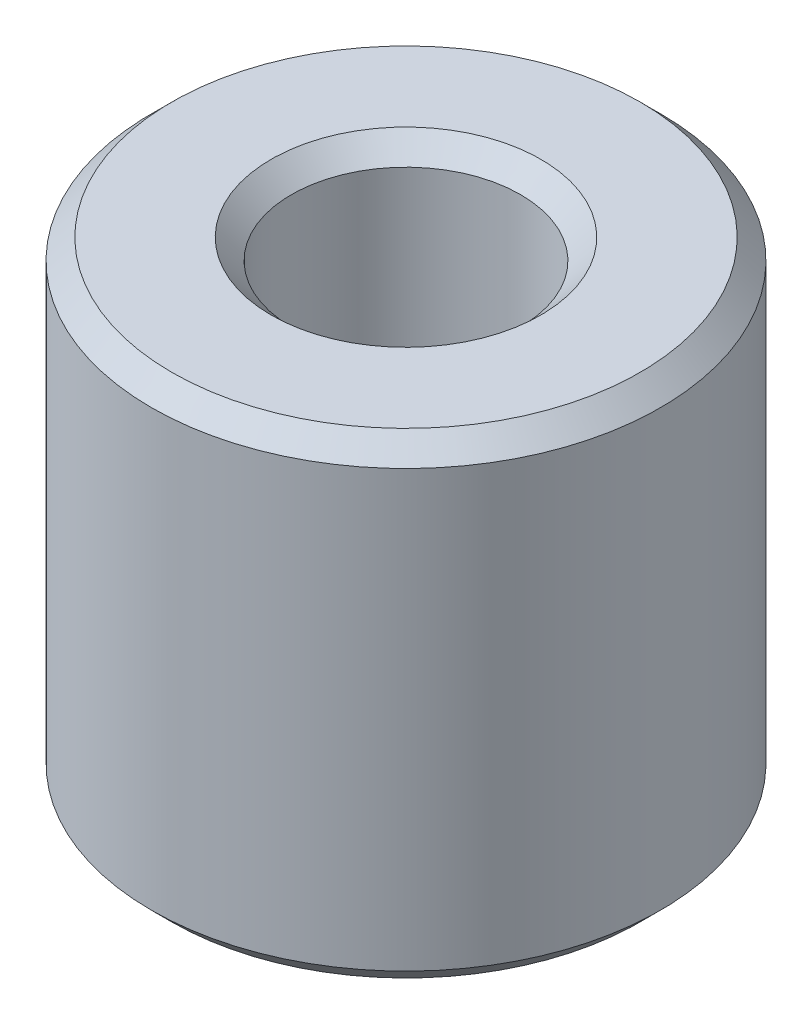
ISO-10303-21;
HEADER;
FILE_DESCRIPTION(('STEP AP214'),'2;1');
FILE_NAME('part.step','',(''),(''),'','','');
FILE_SCHEMA(('AUTOMOTIVE_DESIGN { 1 0 10303 214 1 1 1 1 }'));
ENDSEC;
DATA;
#1=APPLICATION_CONTEXT('core data for automotive mechanical design processes');
#2=APPLICATION_PROTOCOL_DEFINITION('international standard','automotive_design',2000,#1);
#3=PRODUCT_CONTEXT('',#1,'mechanical');
#4=PRODUCT('Part','Part','',(#3));
#5=PRODUCT_RELATED_PRODUCT_CATEGORY('part','',(#4));
#6=PRODUCT_DEFINITION_FORMATION('','',#4);
#7=PRODUCT_DEFINITION_CONTEXT('part definition',#1,'design');
#8=PRODUCT_DEFINITION('design','',#6,#7);
#9=PRODUCT_DEFINITION_SHAPE('','',#8);
#10=(LENGTH_UNIT() NAMED_UNIT(*) SI_UNIT(.MILLI.,.METRE.));
#11=(NAMED_UNIT(*) PLANE_ANGLE_UNIT() SI_UNIT($,.RADIAN.));
#12=(NAMED_UNIT(*) SI_UNIT($,.STERADIAN.) SOLID_ANGLE_UNIT());
#13=UNCERTAINTY_MEASURE_WITH_UNIT(LENGTH_MEASURE(1.E-05),#10,'distance_accuracy_value','');
#14=(GEOMETRIC_REPRESENTATION_CONTEXT(3) GLOBAL_UNCERTAINTY_ASSIGNED_CONTEXT((#13)) GLOBAL_UNIT_ASSIGNED_CONTEXT((#10,
#11,#12)) REPRESENTATION_CONTEXT('',''));
#15=CARTESIAN_POINT('',(0.,0.,0.));
#16=DIRECTION('',(0.,0.,1.));
#17=DIRECTION('',(1.,0.,0.));
#18=AXIS2_PLACEMENT_3D('',#15,#16,#17);
#19=CARTESIAN_POINT('',(0.,18.7,0.));
#20=DIRECTION('',(0.,1.,0.));
#21=DIRECTION('',(0.,0.,1.));
#22=AXIS2_PLACEMENT_3D('',#19,#20,#21);
#23=PLANE('',#22);
#24=CARTESIAN_POINT('',(0.,18.7,0.));
#25=DIRECTION('',(0.,1.,0.));
#26=DIRECTION('',(0.,0.,1.));
#27=AXIS2_PLACEMENT_3D('',#24,#25,#26);
#28=CIRCLE('',#27,9.2);
#29=CARTESIAN_POINT('',(0.,18.7,9.2));
#30=VERTEX_POINT('',#29);
#31=EDGE_CURVE('E12',#30,#30,#28,.T.);
#32=ORIENTED_EDGE('',*,*,#31,.T.);
#33=EDGE_LOOP('',(#32));
#34=FACE_BOUND('',#33,.T.);
#35=CARTESIAN_POINT('',(0.,18.7,0.));
#36=DIRECTION('',(0.,1.,0.));
#37=DIRECTION('',(0.,0.,1.));
#38=AXIS2_PLACEMENT_3D('',#35,#36,#37);
#39=CIRCLE('',#38,5.3);
#40=CARTESIAN_POINT('',(0.,18.7,5.3));
#41=VERTEX_POINT('',#40);
#42=EDGE_CURVE('E51',#41,#41,#39,.F.);
#43=ORIENTED_EDGE('',*,*,#42,.T.);
#44=EDGE_LOOP('',(#43));
#45=FACE_BOUND('',#44,.T.);
#46=ADVANCED_FACE('F44',(#34,#45),#23,.T.);
#47=CARTESIAN_POINT('',(0.,0.,0.));
#48=DIRECTION('',(0.,1.,0.));
#49=DIRECTION('',(0.,0.,1.));
#50=AXIS2_PLACEMENT_3D('',#47,#48,#49);
#51=PLANE('',#50);
#52=CARTESIAN_POINT('',(0.,0.,0.));
#53=DIRECTION('',(0.,1.,0.));
#54=DIRECTION('',(0.,0.,1.));
#55=AXIS2_PLACEMENT_3D('',#52,#53,#54);
#56=CIRCLE('',#55,9.2);
#57=CARTESIAN_POINT('',(0.,0.,9.2));
#58=VERTEX_POINT('',#57);
#59=EDGE_CURVE('E64',#58,#58,#56,.F.);
#60=ORIENTED_EDGE('',*,*,#59,.T.);
#61=EDGE_LOOP('',(#60));
#62=FACE_BOUND('',#61,.T.);
#63=CARTESIAN_POINT('',(0.,0.,0.));
#64=DIRECTION('',(0.,1.,0.));
#65=DIRECTION('',(0.,0.,1.));
#66=AXIS2_PLACEMENT_3D('',#63,#64,#65);
#67=CIRCLE('',#66,5.3);
#68=CARTESIAN_POINT('',(0.,0.,5.3));
#69=VERTEX_POINT('',#68);
#70=EDGE_CURVE('E67',#69,#69,#67,.T.);
#71=ORIENTED_EDGE('',*,*,#70,.T.);
#72=EDGE_LOOP('',(#71));
#73=FACE_BOUND('',#72,.T.);
#74=ADVANCED_FACE('F92',(#62,#73),#51,.F.);
#75=CARTESIAN_POINT('',(0.,18.7,0.));
#76=DIRECTION('',(0.,-1.,0.));
#77=DIRECTION('',(0.,0.,-1.));
#78=AXIS2_PLACEMENT_3D('',#75,#76,#77);
#79=CYLINDRICAL_SURFACE('',#78,10.);
#80=CARTESIAN_POINT('',(0.,0.799999999999995,0.));
#81=DIRECTION('',(0.,1.,0.));
#82=DIRECTION('',(0.,0.,1.));
#83=AXIS2_PLACEMENT_3D('',#80,#81,#82);
#84=CIRCLE('',#83,10.);
#85=CARTESIAN_POINT('',(0.,0.799999999999995,10.));
#86=VERTEX_POINT('',#85);
#87=EDGE_CURVE('E70',#86,#86,#84,.T.);
#88=ORIENTED_EDGE('',*,*,#87,.T.);
#89=EDGE_LOOP('',(#88));
#90=FACE_BOUND('',#89,.T.);
#91=CARTESIAN_POINT('',(0.,17.9,0.));
#92=DIRECTION('',(0.,1.,0.));
#93=DIRECTION('',(0.,0.,1.));
#94=AXIS2_PLACEMENT_3D('',#91,#92,#93);
#95=CIRCLE('',#94,10.);
#96=CARTESIAN_POINT('',(0.,17.9,10.));
#97=VERTEX_POINT('',#96);
#98=EDGE_CURVE('E73',#97,#97,#95,.F.);
#99=ORIENTED_EDGE('',*,*,#98,.T.);
#100=EDGE_LOOP('',(#99));
#101=FACE_BOUND('',#100,.T.);
#102=ADVANCED_FACE('F77',(#90,#101),#79,.T.);
#103=CARTESIAN_POINT('',(0.,18.7,0.));
#104=DIRECTION('',(0.,-1.,0.));
#105=DIRECTION('',(0.,0.,-1.));
#106=AXIS2_PLACEMENT_3D('',#103,#104,#105);
#107=CYLINDRICAL_SURFACE('',#106,4.5);
#108=CARTESIAN_POINT('',(0.,0.800000000000002,0.));
#109=DIRECTION('',(0.,1.,0.));
#110=DIRECTION('',(0.,0.,1.));
#111=AXIS2_PLACEMENT_3D('',#108,#109,#110);
#112=CIRCLE('',#111,4.5);
#113=CARTESIAN_POINT('',(0.,0.800000000000002,4.5));
#114=VERTEX_POINT('',#113);
#115=EDGE_CURVE('E55',#114,#114,#112,.F.);
#116=ORIENTED_EDGE('',*,*,#115,.T.);
#117=EDGE_LOOP('',(#116));
#118=FACE_BOUND('',#117,.T.);
#119=CARTESIAN_POINT('',(0.,17.9,0.));
#120=DIRECTION('',(0.,1.,0.));
#121=DIRECTION('',(0.,0.,1.));
#122=AXIS2_PLACEMENT_3D('',#119,#120,#121);
#123=CIRCLE('',#122,4.5);
#124=CARTESIAN_POINT('',(0.,17.9,4.5));
#125=VERTEX_POINT('',#124);
#126=EDGE_CURVE('E59',#125,#125,#123,.T.);
#127=ORIENTED_EDGE('',*,*,#126,.T.);
#128=EDGE_LOOP('',(#127));
#129=FACE_BOUND('',#128,.T.);
#130=ADVANCED_FACE('F100',(#118,#129),#107,.F.);
#131=CARTESIAN_POINT('',(0.,0.799999999999995,0.));
#132=DIRECTION('',(0.,1.,0.));
#133=DIRECTION('',(0.,0.,1.));
#134=AXIS2_PLACEMENT_3D('',#131,#132,#133);
#135=CONICAL_SURFACE('',#134,10.,0.78539816339745);
#136=ORIENTED_EDGE('',*,*,#59,.F.);
#137=EDGE_LOOP('',(#136));
#138=FACE_BOUND('',#137,.T.);
#139=ORIENTED_EDGE('',*,*,#87,.F.);
#140=EDGE_LOOP('',(#139));
#141=FACE_BOUND('',#140,.T.);
#142=ADVANCED_FACE('F88',(#138,#141),#135,.T.);
#143=CARTESIAN_POINT('',(0.,0.,0.));
#144=DIRECTION('',(0.,-1.,0.));
#145=DIRECTION('',(0.,0.,-1.));
#146=AXIS2_PLACEMENT_3D('',#143,#144,#145);
#147=CONICAL_SURFACE('',#146,5.3,0.785398163397447);
#148=ORIENTED_EDGE('',*,*,#115,.F.);
#149=EDGE_LOOP('',(#148));
#150=FACE_BOUND('',#149,.T.);
#151=ORIENTED_EDGE('',*,*,#70,.F.);
#152=EDGE_LOOP('',(#151));
#153=FACE_BOUND('',#152,.T.);
#154=ADVANCED_FACE('F82',(#150,#153),#147,.F.);
#155=CARTESIAN_POINT('',(0.,18.7,0.));
#156=DIRECTION('',(0.,-1.,0.));
#157=DIRECTION('',(0.,0.,-1.));
#158=AXIS2_PLACEMENT_3D('',#155,#156,#157);
#159=CONICAL_SURFACE('',#158,9.2,0.785398163397445);
#160=ORIENTED_EDGE('',*,*,#98,.F.);
#161=EDGE_LOOP('',(#160));
#162=FACE_BOUND('',#161,.T.);
#163=ORIENTED_EDGE('',*,*,#31,.F.);
#164=EDGE_LOOP('',(#163));
#165=FACE_BOUND('',#164,.T.);
#166=ADVANCED_FACE('F79',(#162,#165),#159,.T.);
#167=CARTESIAN_POINT('',(0.,17.9,0.));
#168=DIRECTION('',(0.,1.,0.));
#169=DIRECTION('',(0.,0.,1.));
#170=AXIS2_PLACEMENT_3D('',#167,#168,#169);
#171=CONICAL_SURFACE('',#170,4.5,0.785398163397452);
#172=ORIENTED_EDGE('',*,*,#42,.F.);
#173=EDGE_LOOP('',(#172));
#174=FACE_BOUND('',#173,.T.);
#175=ORIENTED_EDGE('',*,*,#126,.F.);
#176=EDGE_LOOP('',(#175));
#177=FACE_BOUND('',#176,.T.);
#178=ADVANCED_FACE('F46',(#174,#177),#171,.F.);
#179=CLOSED_SHELL('',(#46,#74,#102,#130,#142,#154,#166,#178));
#180=MANIFOLD_SOLID_BREP('B2',#179);
#181=ADVANCED_BREP_SHAPE_REPRESENTATION('',(#18,#180),#14);
#182=SHAPE_DEFINITION_REPRESENTATION(#9,#181);
ENDSEC;
END-ISO-10303-21;
